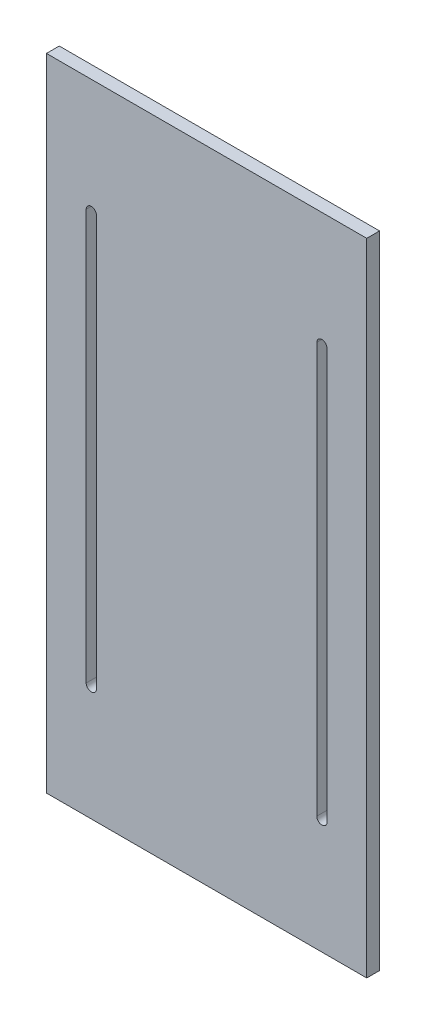
ISO-10303-21;
HEADER;
FILE_DESCRIPTION(('STEP AP214'),'2;1');
FILE_NAME('part.step','',(''),(''),'','','');
FILE_SCHEMA(('AUTOMOTIVE_DESIGN { 1 0 10303 214 1 1 1 1 }'));
ENDSEC;
DATA;
#1=APPLICATION_CONTEXT('core data for automotive mechanical design processes');
#2=APPLICATION_PROTOCOL_DEFINITION('international standard','automotive_design',2000,#1);
#3=PRODUCT_CONTEXT('',#1,'mechanical');
#4=PRODUCT('Part','Part','',(#3));
#5=PRODUCT_RELATED_PRODUCT_CATEGORY('part','',(#4));
#6=PRODUCT_DEFINITION_FORMATION('','',#4);
#7=PRODUCT_DEFINITION_CONTEXT('part definition',#1,'design');
#8=PRODUCT_DEFINITION('design','',#6,#7);
#9=PRODUCT_DEFINITION_SHAPE('','',#8);
#10=(LENGTH_UNIT() NAMED_UNIT(*) SI_UNIT(.MILLI.,.METRE.));
#11=(NAMED_UNIT(*) PLANE_ANGLE_UNIT() SI_UNIT($,.RADIAN.));
#12=(NAMED_UNIT(*) SI_UNIT($,.STERADIAN.) SOLID_ANGLE_UNIT());
#13=UNCERTAINTY_MEASURE_WITH_UNIT(LENGTH_MEASURE(1.E-05),#10,'distance_accuracy_value','');
#14=(GEOMETRIC_REPRESENTATION_CONTEXT(3) GLOBAL_UNCERTAINTY_ASSIGNED_CONTEXT((#13)) GLOBAL_UNIT_ASSIGNED_CONTEXT((#10,
#11,#12)) REPRESENTATION_CONTEXT('',''));
#15=CARTESIAN_POINT('',(0.,0.,0.));
#16=DIRECTION('',(0.,0.,1.));
#17=DIRECTION('',(1.,0.,0.));
#18=AXIS2_PLACEMENT_3D('',#15,#16,#17);
#19=CARTESIAN_POINT('',(25.0000000000002,-50.0000000000003,2.));
#20=DIRECTION('',(-1.,0.,0.));
#21=DIRECTION('',(0.,0.,1.));
#22=AXIS2_PLACEMENT_3D('',#19,#20,#21);
#23=PLANE('',#22);
#24=DIRECTION('',(0.,1.,0.));
#25=VECTOR('',#24,1.);
#26=CARTESIAN_POINT('',(25.0000000000002,-50.0000000000003,0.));
#27=LINE('',#26,#25);
#28=CARTESIAN_POINT('',(25.0000000000002,-50.0000000000003,0.));
#29=VERTEX_POINT('',#28);
#30=CARTESIAN_POINT('',(25.0000000000002,50.0000000000003,0.));
#31=VERTEX_POINT('',#30);
#32=EDGE_CURVE('E237',#29,#31,#27,.T.);
#33=ORIENTED_EDGE('',*,*,#32,.T.);
#34=DIRECTION('',(0.,0.,-1.));
#35=VECTOR('',#34,1.);
#36=CARTESIAN_POINT('',(25.0000000000002,50.0000000000003,2.));
#37=LINE('',#36,#35);
#38=CARTESIAN_POINT('',(25.0000000000002,50.0000000000003,2.));
#39=VERTEX_POINT('',#38);
#40=EDGE_CURVE('E11',#39,#31,#37,.T.);
#41=ORIENTED_EDGE('',*,*,#40,.F.);
#42=DIRECTION('',(0.,1.,0.));
#43=VECTOR('',#42,1.);
#44=CARTESIAN_POINT('',(25.0000000000002,-50.0000000000003,2.));
#45=LINE('',#44,#43);
#46=CARTESIAN_POINT('',(25.0000000000002,-50.0000000000003,2.));
#47=VERTEX_POINT('',#46);
#48=EDGE_CURVE('E240',#47,#39,#45,.T.);
#49=ORIENTED_EDGE('',*,*,#48,.F.);
#50=DIRECTION('',(0.,0.,-1.));
#51=VECTOR('',#50,1.);
#52=CARTESIAN_POINT('',(25.0000000000002,-50.0000000000003,2.));
#53=LINE('',#52,#51);
#54=EDGE_CURVE('E250',#47,#29,#53,.T.);
#55=ORIENTED_EDGE('',*,*,#54,.T.);
#56=EDGE_LOOP('',(#33,#41,#49,#55));
#57=FACE_BOUND('',#56,.T.);
#58=ADVANCED_FACE('F40',(#57),#23,.F.);
#59=CARTESIAN_POINT('',(-25.0000000000002,50.0000000000004,1.99999999999985));
#60=DIRECTION('',(0.,-1.,0.));
#61=DIRECTION('',(0.,0.,-1.));
#62=AXIS2_PLACEMENT_3D('',#59,#60,#61);
#63=PLANE('',#62);
#64=DIRECTION('',(-1.,0.,0.));
#65=VECTOR('',#64,1.);
#66=CARTESIAN_POINT('',(-25.0000000000002,50.0000000000004,-1.52655665885959E-13));
#67=LINE('',#66,#65);
#68=CARTESIAN_POINT('',(-25.0000000000002,50.0000000000004,-1.52655665885959E-13));
#69=VERTEX_POINT('',#68);
#70=EDGE_CURVE('E254',#31,#69,#67,.T.);
#71=ORIENTED_EDGE('',*,*,#70,.T.);
#72=DIRECTION('',(0.,0.,-1.));
#73=VECTOR('',#72,1.);
#74=CARTESIAN_POINT('',(-25.0000000000002,50.0000000000004,1.99999999999985));
#75=LINE('',#74,#73);
#76=CARTESIAN_POINT('',(-25.0000000000002,50.0000000000004,1.99999999999985));
#77=VERTEX_POINT('',#76);
#78=EDGE_CURVE('E49',#77,#69,#75,.T.);
#79=ORIENTED_EDGE('',*,*,#78,.F.);
#80=DIRECTION('',(-1.,0.,0.));
#81=VECTOR('',#80,1.);
#82=CARTESIAN_POINT('',(-25.0000000000002,50.0000000000004,1.99999999999985));
#83=LINE('',#82,#81);
#84=EDGE_CURVE('E88',#39,#77,#83,.T.);
#85=ORIENTED_EDGE('',*,*,#84,.F.);
#86=ORIENTED_EDGE('',*,*,#40,.T.);
#87=EDGE_LOOP('',(#71,#79,#85,#86));
#88=FACE_BOUND('',#87,.T.);
#89=ADVANCED_FACE('F283',(#88),#63,.F.);
#90=CARTESIAN_POINT('',(-25.0000000000002,-50.0000000000002,1.99999999999985));
#91=DIRECTION('',(1.,0.,0.));
#92=DIRECTION('',(0.,0.,-1.));
#93=AXIS2_PLACEMENT_3D('',#90,#91,#92);
#94=PLANE('',#93);
#95=DIRECTION('',(0.,-1.,0.));
#96=VECTOR('',#95,1.);
#97=CARTESIAN_POINT('',(-25.0000000000002,-50.0000000000002,-1.52655665885959E-13));
#98=LINE('',#97,#96);
#99=CARTESIAN_POINT('',(-25.0000000000002,-50.0000000000002,-1.52655665885959E-13));
#100=VERTEX_POINT('',#99);
#101=EDGE_CURVE('E75',#69,#100,#98,.T.);
#102=ORIENTED_EDGE('',*,*,#101,.T.);
#103=DIRECTION('',(0.,0.,-1.));
#104=VECTOR('',#103,1.);
#105=CARTESIAN_POINT('',(-25.0000000000002,-50.0000000000002,1.99999999999985));
#106=LINE('',#105,#104);
#107=CARTESIAN_POINT('',(-25.0000000000002,-50.0000000000002,1.99999999999985));
#108=VERTEX_POINT('',#107);
#109=EDGE_CURVE('E263',#108,#100,#106,.T.);
#110=ORIENTED_EDGE('',*,*,#109,.F.);
#111=DIRECTION('',(0.,-1.,0.));
#112=VECTOR('',#111,1.);
#113=CARTESIAN_POINT('',(-25.0000000000002,-50.0000000000002,1.99999999999985));
#114=LINE('',#113,#112);
#115=EDGE_CURVE('E245',#77,#108,#114,.T.);
#116=ORIENTED_EDGE('',*,*,#115,.F.);
#117=ORIENTED_EDGE('',*,*,#78,.T.);
#118=EDGE_LOOP('',(#102,#110,#116,#117));
#119=FACE_BOUND('',#118,.T.);
#120=ADVANCED_FACE('F268',(#119),#94,.F.);
#121=CARTESIAN_POINT('',(-25.0000000000002,-50.0000000000002,1.99999999999985));
#122=DIRECTION('',(0.,1.,0.));
#123=DIRECTION('',(0.,0.,1.));
#124=AXIS2_PLACEMENT_3D('',#121,#122,#123);
#125=PLANE('',#124);
#126=DIRECTION('',(1.,0.,0.));
#127=VECTOR('',#126,1.);
#128=CARTESIAN_POINT('',(-25.0000000000002,-50.0000000000002,-1.52655665885959E-13));
#129=LINE('',#128,#127);
#130=EDGE_CURVE('E81',#100,#29,#129,.T.);
#131=ORIENTED_EDGE('',*,*,#130,.T.);
#132=ORIENTED_EDGE('',*,*,#54,.F.);
#133=DIRECTION('',(1.,0.,0.));
#134=VECTOR('',#133,1.);
#135=CARTESIAN_POINT('',(-25.0000000000002,-50.0000000000002,1.99999999999985));
#136=LINE('',#135,#134);
#137=EDGE_CURVE('E57',#108,#47,#136,.T.);
#138=ORIENTED_EDGE('',*,*,#137,.F.);
#139=ORIENTED_EDGE('',*,*,#109,.T.);
#140=EDGE_LOOP('',(#131,#132,#138,#139));
#141=FACE_BOUND('',#140,.T.);
#142=ADVANCED_FACE('F275',(#141),#125,.F.);
#143=CARTESIAN_POINT('',(0.,0.,2.));
#144=DIRECTION('',(0.,0.,-1.));
#145=DIRECTION('',(-1.,0.,0.));
#146=AXIS2_PLACEMENT_3D('',#143,#144,#145);
#147=PLANE('',#146);
#148=DIRECTION('',(0.,-1.,0.));
#149=VECTOR('',#148,1.);
#150=CARTESIAN_POINT('',(18.8000000000001,0.,2.));
#151=LINE('',#150,#149);
#152=CARTESIAN_POINT('',(18.8000000000001,32.0219506363315,2.));
#153=VERTEX_POINT('',#152);
#154=CARTESIAN_POINT('',(18.8000000000001,-32.0219506363314,2.));
#155=VERTEX_POINT('',#154);
#156=EDGE_CURVE('E140',#153,#155,#151,.T.);
#157=ORIENTED_EDGE('',*,*,#156,.T.);
#158=CARTESIAN_POINT('',(18.0000000000001,-32.0219506363314,2.));
#159=DIRECTION('',(0.,0.,1.));
#160=DIRECTION('',(1.,0.,0.));
#161=AXIS2_PLACEMENT_3D('',#158,#159,#160);
#162=CIRCLE('',#161,0.8);
#163=CARTESIAN_POINT('',(17.2000000000001,-32.0219506363314,2.));
#164=VERTEX_POINT('',#163);
#165=EDGE_CURVE('E145',#164,#155,#162,.T.);
#166=ORIENTED_EDGE('',*,*,#165,.F.);
#167=DIRECTION('',(0.,1.,0.));
#168=VECTOR('',#167,1.);
#169=CARTESIAN_POINT('',(17.2000000000001,0.,2.));
#170=LINE('',#169,#168);
#171=CARTESIAN_POINT('',(17.2000000000001,32.0219506363315,2.));
#172=VERTEX_POINT('',#171);
#173=EDGE_CURVE('E151',#164,#172,#170,.T.);
#174=ORIENTED_EDGE('',*,*,#173,.T.);
#175=CARTESIAN_POINT('',(18.0000000000001,32.0219506363315,2.));
#176=DIRECTION('',(0.,0.,-1.));
#177=DIRECTION('',(1.,0.,0.));
#178=AXIS2_PLACEMENT_3D('',#175,#176,#177);
#179=CIRCLE('',#178,0.8);
#180=EDGE_CURVE('E147',#172,#153,#179,.T.);
#181=ORIENTED_EDGE('',*,*,#180,.T.);
#182=EDGE_LOOP('',(#157,#166,#174,#181));
#183=FACE_BOUND('',#182,.T.);
#184=DIRECTION('',(0.,-1.,0.));
#185=VECTOR('',#184,1.);
#186=CARTESIAN_POINT('',(-17.2000000000001,0.,2.));
#187=LINE('',#186,#185);
#188=CARTESIAN_POINT('',(-17.2000000000001,32.0219506363314,2.));
#189=VERTEX_POINT('',#188);
#190=CARTESIAN_POINT('',(-17.2000000000001,-32.0219506363314,2.));
#191=VERTEX_POINT('',#190);
#192=EDGE_CURVE('E193',#189,#191,#187,.T.);
#193=ORIENTED_EDGE('',*,*,#192,.T.);
#194=CARTESIAN_POINT('',(-18.0000000000001,-32.0219506363314,2.));
#195=DIRECTION('',(0.,0.,1.));
#196=DIRECTION('',(1.,0.,0.));
#197=AXIS2_PLACEMENT_3D('',#194,#195,#196);
#198=CIRCLE('',#197,0.8);
#199=CARTESIAN_POINT('',(-18.8000000000001,-32.0219506363314,2.));
#200=VERTEX_POINT('',#199);
#201=EDGE_CURVE('E177',#200,#191,#198,.T.);
#202=ORIENTED_EDGE('',*,*,#201,.F.);
#203=DIRECTION('',(0.,1.,0.));
#204=VECTOR('',#203,1.);
#205=CARTESIAN_POINT('',(-18.8000000000001,0.,2.));
#206=LINE('',#205,#204);
#207=CARTESIAN_POINT('',(-18.8000000000001,32.0219506363314,2.));
#208=VERTEX_POINT('',#207);
#209=EDGE_CURVE('E196',#200,#208,#206,.T.);
#210=ORIENTED_EDGE('',*,*,#209,.T.);
#211=CARTESIAN_POINT('',(-18.0000000000001,32.0219506363314,2.));
#212=DIRECTION('',(0.,0.,-1.));
#213=DIRECTION('',(1.,0.,0.));
#214=AXIS2_PLACEMENT_3D('',#211,#212,#213);
#215=CIRCLE('',#214,0.8);
#216=EDGE_CURVE('E201',#208,#189,#215,.T.);
#217=ORIENTED_EDGE('',*,*,#216,.T.);
#218=EDGE_LOOP('',(#193,#202,#210,#217));
#219=FACE_BOUND('',#218,.T.);
#220=ORIENTED_EDGE('',*,*,#48,.T.);
#221=ORIENTED_EDGE('',*,*,#84,.T.);
#222=ORIENTED_EDGE('',*,*,#115,.T.);
#223=ORIENTED_EDGE('',*,*,#137,.T.);
#224=EDGE_LOOP('',(#220,#221,#222,#223));
#225=FACE_BOUND('',#224,.T.);
#226=ADVANCED_FACE('F142',(#183,#219,#225),#147,.F.);
#227=CARTESIAN_POINT('',(0.,0.,0.));
#228=DIRECTION('',(0.,0.,-1.));
#229=DIRECTION('',(-1.,0.,0.));
#230=AXIS2_PLACEMENT_3D('',#227,#228,#229);
#231=PLANE('',#230);
#232=CARTESIAN_POINT('',(-18.0000000000001,-32.0219506363314,0.));
#233=DIRECTION('',(0.,0.,1.));
#234=DIRECTION('',(1.,0.,0.));
#235=AXIS2_PLACEMENT_3D('',#232,#233,#234);
#236=CIRCLE('',#235,0.8);
#237=CARTESIAN_POINT('',(-18.8000000000001,-32.0219506363314,0.));
#238=VERTEX_POINT('',#237);
#239=CARTESIAN_POINT('',(-17.2000000000001,-32.0219506363314,0.));
#240=VERTEX_POINT('',#239);
#241=EDGE_CURVE('E182',#238,#240,#236,.T.);
#242=ORIENTED_EDGE('',*,*,#241,.T.);
#243=DIRECTION('',(0.,-1.,0.));
#244=VECTOR('',#243,1.);
#245=CARTESIAN_POINT('',(-17.2000000000001,0.,0.));
#246=LINE('',#245,#244);
#247=CARTESIAN_POINT('',(-17.2000000000001,32.0219506363314,0.));
#248=VERTEX_POINT('',#247);
#249=EDGE_CURVE('E173',#248,#240,#246,.T.);
#250=ORIENTED_EDGE('',*,*,#249,.F.);
#251=CARTESIAN_POINT('',(-18.0000000000001,32.0219506363314,0.));
#252=DIRECTION('',(0.,0.,-1.));
#253=DIRECTION('',(1.,0.,0.));
#254=AXIS2_PLACEMENT_3D('',#251,#252,#253);
#255=CIRCLE('',#254,0.8);
#256=CARTESIAN_POINT('',(-18.8000000000001,32.0219506363314,0.));
#257=VERTEX_POINT('',#256);
#258=EDGE_CURVE('E197',#257,#248,#255,.T.);
#259=ORIENTED_EDGE('',*,*,#258,.F.);
#260=DIRECTION('',(0.,1.,0.));
#261=VECTOR('',#260,1.);
#262=CARTESIAN_POINT('',(-18.8000000000001,0.,0.));
#263=LINE('',#262,#261);
#264=EDGE_CURVE('E208',#238,#257,#263,.T.);
#265=ORIENTED_EDGE('',*,*,#264,.F.);
#266=EDGE_LOOP('',(#242,#250,#259,#265));
#267=FACE_BOUND('',#266,.T.);
#268=CARTESIAN_POINT('',(18.0000000000001,-32.0219506363314,0.));
#269=DIRECTION('',(0.,0.,1.));
#270=DIRECTION('',(1.,0.,0.));
#271=AXIS2_PLACEMENT_3D('',#268,#269,#270);
#272=CIRCLE('',#271,0.8);
#273=CARTESIAN_POINT('',(17.2000000000001,-32.0219506363314,0.));
#274=VERTEX_POINT('',#273);
#275=CARTESIAN_POINT('',(18.8000000000001,-32.0219506363314,0.));
#276=VERTEX_POINT('',#275);
#277=EDGE_CURVE('E164',#274,#276,#272,.T.);
#278=ORIENTED_EDGE('',*,*,#277,.T.);
#279=DIRECTION('',(0.,-1.,0.));
#280=VECTOR('',#279,1.);
#281=CARTESIAN_POINT('',(18.8000000000001,0.,0.));
#282=LINE('',#281,#280);
#283=CARTESIAN_POINT('',(18.8000000000001,32.0219506363315,0.));
#284=VERTEX_POINT('',#283);
#285=EDGE_CURVE('E168',#284,#276,#282,.T.);
#286=ORIENTED_EDGE('',*,*,#285,.F.);
#287=CARTESIAN_POINT('',(18.0000000000001,32.0219506363315,0.));
#288=DIRECTION('',(0.,0.,-1.));
#289=DIRECTION('',(1.,0.,0.));
#290=AXIS2_PLACEMENT_3D('',#287,#288,#289);
#291=CIRCLE('',#290,0.8);
#292=CARTESIAN_POINT('',(17.2000000000001,32.0219506363315,0.));
#293=VERTEX_POINT('',#292);
#294=EDGE_CURVE('E152',#293,#284,#291,.T.);
#295=ORIENTED_EDGE('',*,*,#294,.F.);
#296=DIRECTION('',(0.,1.,0.));
#297=VECTOR('',#296,1.);
#298=CARTESIAN_POINT('',(17.2000000000001,0.,0.));
#299=LINE('',#298,#297);
#300=EDGE_CURVE('E227',#274,#293,#299,.T.);
#301=ORIENTED_EDGE('',*,*,#300,.F.);
#302=EDGE_LOOP('',(#278,#286,#295,#301));
#303=FACE_BOUND('',#302,.T.);
#304=ORIENTED_EDGE('',*,*,#32,.F.);
#305=ORIENTED_EDGE('',*,*,#130,.F.);
#306=ORIENTED_EDGE('',*,*,#101,.F.);
#307=ORIENTED_EDGE('',*,*,#70,.F.);
#308=EDGE_LOOP('',(#304,#305,#306,#307));
#309=FACE_BOUND('',#308,.T.);
#310=ADVANCED_FACE('F271',(#267,#303,#309),#231,.T.);
#311=CARTESIAN_POINT('',(18.8000000000001,0.,2.));
#312=DIRECTION('',(1.,0.,0.));
#313=DIRECTION('',(0.,0.,-1.));
#314=AXIS2_PLACEMENT_3D('',#311,#312,#313);
#315=PLANE('',#314);
#316=ORIENTED_EDGE('',*,*,#285,.T.);
#317=DIRECTION('',(0.,0.,-1.));
#318=VECTOR('',#317,1.);
#319=CARTESIAN_POINT('',(18.8000000000001,-32.0219506363314,2.));
#320=LINE('',#319,#318);
#321=EDGE_CURVE('E159',#155,#276,#320,.T.);
#322=ORIENTED_EDGE('',*,*,#321,.F.);
#323=ORIENTED_EDGE('',*,*,#156,.F.);
#324=DIRECTION('',(0.,0.,-1.));
#325=VECTOR('',#324,1.);
#326=CARTESIAN_POINT('',(18.8000000000001,32.0219506363315,2.));
#327=LINE('',#326,#325);
#328=EDGE_CURVE('E234',#153,#284,#327,.T.);
#329=ORIENTED_EDGE('',*,*,#328,.T.);
#330=EDGE_LOOP('',(#316,#322,#323,#329));
#331=FACE_BOUND('',#330,.T.);
#332=ADVANCED_FACE('F166',(#331),#315,.F.);
#333=CARTESIAN_POINT('',(18.0000000000001,32.0219506363315,2.));
#334=DIRECTION('',(0.,0.,-1.));
#335=DIRECTION('',(-1.,0.,0.));
#336=AXIS2_PLACEMENT_3D('',#333,#334,#335);
#337=CYLINDRICAL_SURFACE('',#336,0.8);
#338=ORIENTED_EDGE('',*,*,#294,.T.);
#339=ORIENTED_EDGE('',*,*,#328,.F.);
#340=ORIENTED_EDGE('',*,*,#180,.F.);
#341=DIRECTION('',(0.,0.,-1.));
#342=VECTOR('',#341,1.);
#343=CARTESIAN_POINT('',(17.2000000000001,32.0219506363315,2.));
#344=LINE('',#343,#342);
#345=EDGE_CURVE('E224',#172,#293,#344,.T.);
#346=ORIENTED_EDGE('',*,*,#345,.T.);
#347=EDGE_LOOP('',(#338,#339,#340,#346));
#348=FACE_BOUND('',#347,.T.);
#349=ADVANCED_FACE('F324',(#348),#337,.F.);
#350=CARTESIAN_POINT('',(17.2000000000001,0.,2.));
#351=DIRECTION('',(-1.,0.,0.));
#352=DIRECTION('',(0.,-1.,0.));
#353=AXIS2_PLACEMENT_3D('',#350,#351,#352);
#354=PLANE('',#353);
#355=ORIENTED_EDGE('',*,*,#300,.T.);
#356=ORIENTED_EDGE('',*,*,#345,.F.);
#357=ORIENTED_EDGE('',*,*,#173,.F.);
#358=DIRECTION('',(0.,0.,-1.));
#359=VECTOR('',#358,1.);
#360=CARTESIAN_POINT('',(17.2000000000001,-32.0219506363314,2.));
#361=LINE('',#360,#359);
#362=EDGE_CURVE('E162',#164,#274,#361,.T.);
#363=ORIENTED_EDGE('',*,*,#362,.T.);
#364=EDGE_LOOP('',(#355,#356,#357,#363));
#365=FACE_BOUND('',#364,.T.);
#366=ADVANCED_FACE('F335',(#365),#354,.F.);
#367=CARTESIAN_POINT('',(-17.2000000000001,0.,2.));
#368=DIRECTION('',(1.,0.,0.));
#369=DIRECTION('',(0.,0.,-1.));
#370=AXIS2_PLACEMENT_3D('',#367,#368,#369);
#371=PLANE('',#370);
#372=ORIENTED_EDGE('',*,*,#249,.T.);
#373=DIRECTION('',(0.,0.,-1.));
#374=VECTOR('',#373,1.);
#375=CARTESIAN_POINT('',(-17.2000000000001,-32.0219506363314,2.));
#376=LINE('',#375,#374);
#377=EDGE_CURVE('E181',#191,#240,#376,.T.);
#378=ORIENTED_EDGE('',*,*,#377,.F.);
#379=ORIENTED_EDGE('',*,*,#192,.F.);
#380=DIRECTION('',(0.,0.,-1.));
#381=VECTOR('',#380,1.);
#382=CARTESIAN_POINT('',(-17.2000000000001,32.0219506363314,2.));
#383=LINE('',#382,#381);
#384=EDGE_CURVE('E215',#189,#248,#383,.T.);
#385=ORIENTED_EDGE('',*,*,#384,.T.);
#386=EDGE_LOOP('',(#372,#378,#379,#385));
#387=FACE_BOUND('',#386,.T.);
#388=ADVANCED_FACE('F345',(#387),#371,.F.);
#389=CARTESIAN_POINT('',(-18.0000000000001,32.0219506363314,2.));
#390=DIRECTION('',(0.,0.,-1.));
#391=DIRECTION('',(-1.,0.,0.));
#392=AXIS2_PLACEMENT_3D('',#389,#390,#391);
#393=CYLINDRICAL_SURFACE('',#392,0.8);
#394=ORIENTED_EDGE('',*,*,#258,.T.);
#395=ORIENTED_EDGE('',*,*,#384,.F.);
#396=ORIENTED_EDGE('',*,*,#216,.F.);
#397=DIRECTION('',(0.,0.,-1.));
#398=VECTOR('',#397,1.);
#399=CARTESIAN_POINT('',(-18.8000000000001,32.0219506363314,2.));
#400=LINE('',#399,#398);
#401=EDGE_CURVE('E205',#208,#257,#400,.T.);
#402=ORIENTED_EDGE('',*,*,#401,.T.);
#403=EDGE_LOOP('',(#394,#395,#396,#402));
#404=FACE_BOUND('',#403,.T.);
#405=ADVANCED_FACE('F355',(#404),#393,.F.);
#406=CARTESIAN_POINT('',(-18.8000000000001,0.,2.));
#407=DIRECTION('',(-1.,0.,0.));
#408=DIRECTION('',(0.,-1.,0.));
#409=AXIS2_PLACEMENT_3D('',#406,#407,#408);
#410=PLANE('',#409);
#411=ORIENTED_EDGE('',*,*,#264,.T.);
#412=ORIENTED_EDGE('',*,*,#401,.F.);
#413=ORIENTED_EDGE('',*,*,#209,.F.);
#414=DIRECTION('',(0.,0.,-1.));
#415=VECTOR('',#414,1.);
#416=CARTESIAN_POINT('',(-18.8000000000001,-32.0219506363314,2.));
#417=LINE('',#416,#415);
#418=EDGE_CURVE('E186',#200,#238,#417,.T.);
#419=ORIENTED_EDGE('',*,*,#418,.T.);
#420=EDGE_LOOP('',(#411,#412,#413,#419));
#421=FACE_BOUND('',#420,.T.);
#422=ADVANCED_FACE('F367',(#421),#410,.F.);
#423=CARTESIAN_POINT('',(-18.0000000000001,-32.0219506363314,2.));
#424=DIRECTION('',(0.,0.,-1.));
#425=DIRECTION('',(-1.,0.,0.));
#426=AXIS2_PLACEMENT_3D('',#423,#424,#425);
#427=CYLINDRICAL_SURFACE('',#426,0.8);
#428=ORIENTED_EDGE('',*,*,#241,.F.);
#429=ORIENTED_EDGE('',*,*,#418,.F.);
#430=ORIENTED_EDGE('',*,*,#201,.T.);
#431=ORIENTED_EDGE('',*,*,#377,.T.);
#432=EDGE_LOOP('',(#428,#429,#430,#431));
#433=FACE_BOUND('',#432,.T.);
#434=ADVANCED_FACE('F376',(#433),#427,.F.);
#435=CARTESIAN_POINT('',(18.0000000000001,-32.0219506363314,2.));
#436=DIRECTION('',(0.,0.,-1.));
#437=DIRECTION('',(-1.,0.,0.));
#438=AXIS2_PLACEMENT_3D('',#435,#436,#437);
#439=CYLINDRICAL_SURFACE('',#438,0.8);
#440=ORIENTED_EDGE('',*,*,#277,.F.);
#441=ORIENTED_EDGE('',*,*,#362,.F.);
#442=ORIENTED_EDGE('',*,*,#165,.T.);
#443=ORIENTED_EDGE('',*,*,#321,.T.);
#444=EDGE_LOOP('',(#440,#441,#442,#443));
#445=FACE_BOUND('',#444,.T.);
#446=ADVANCED_FACE('F158',(#445),#439,.F.);
#447=CLOSED_SHELL('',(#58,#89,#120,#142,#226,#310,#332,#349,#366,#388,#405,#422,#434,#446));
#448=MANIFOLD_SOLID_BREP('B2',#447);
#449=ADVANCED_BREP_SHAPE_REPRESENTATION('',(#18,#448),#14);
#450=SHAPE_DEFINITION_REPRESENTATION(#9,#449);
ENDSEC;
END-ISO-10303-21;
